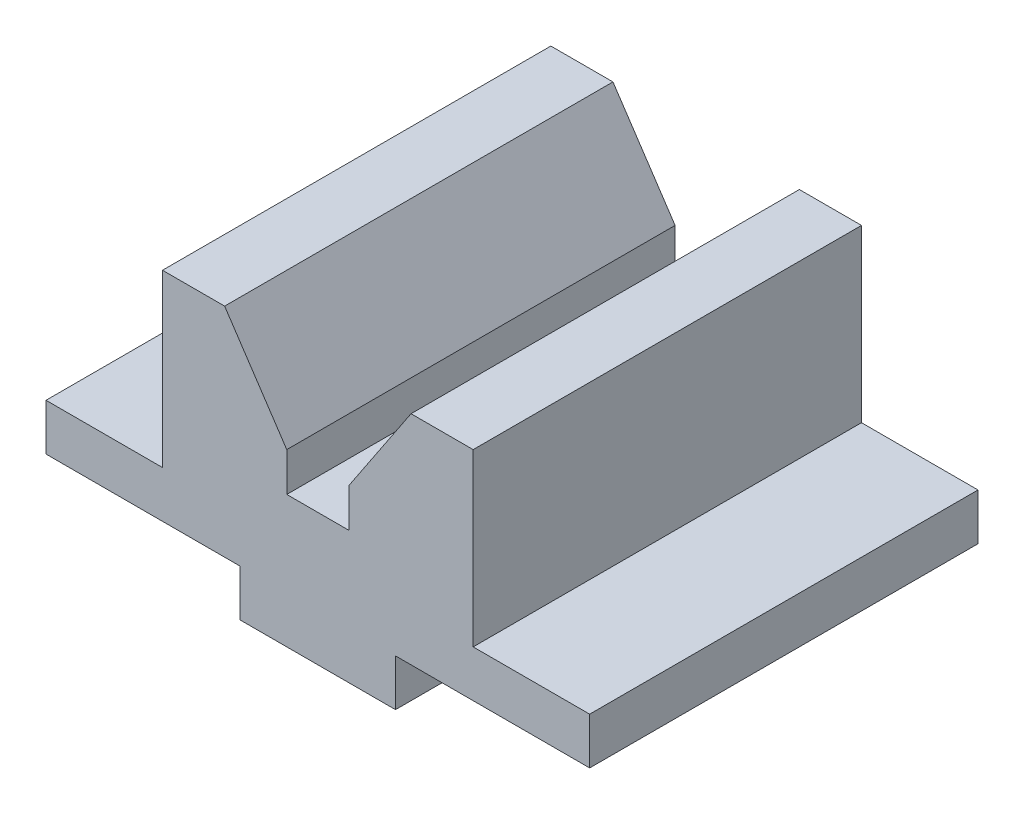
ISO-10303-21;
HEADER;
FILE_DESCRIPTION(('STEP AP214'),'2;1');
FILE_NAME('part.step','',(''),(''),'','','');
FILE_SCHEMA(('AUTOMOTIVE_DESIGN { 1 0 10303 214 1 1 1 1 }'));
ENDSEC;
DATA;
#1=APPLICATION_CONTEXT('core data for automotive mechanical design processes');
#2=APPLICATION_PROTOCOL_DEFINITION('international standard','automotive_design',2000,#1);
#3=PRODUCT_CONTEXT('',#1,'mechanical');
#4=PRODUCT('Part','Part','',(#3));
#5=PRODUCT_RELATED_PRODUCT_CATEGORY('part','',(#4));
#6=PRODUCT_DEFINITION_FORMATION('','',#4);
#7=PRODUCT_DEFINITION_CONTEXT('part definition',#1,'design');
#8=PRODUCT_DEFINITION('design','',#6,#7);
#9=PRODUCT_DEFINITION_SHAPE('','',#8);
#10=(LENGTH_UNIT() NAMED_UNIT(*) SI_UNIT(.MILLI.,.METRE.));
#11=(NAMED_UNIT(*) PLANE_ANGLE_UNIT() SI_UNIT($,.RADIAN.));
#12=(NAMED_UNIT(*) SI_UNIT($,.STERADIAN.) SOLID_ANGLE_UNIT());
#13=UNCERTAINTY_MEASURE_WITH_UNIT(LENGTH_MEASURE(1.E-05),#10,'distance_accuracy_value','');
#14=(GEOMETRIC_REPRESENTATION_CONTEXT(3) GLOBAL_UNCERTAINTY_ASSIGNED_CONTEXT((#13)) GLOBAL_UNIT_ASSIGNED_CONTEXT((#10,
#11,#12)) REPRESENTATION_CONTEXT('',''));
#15=CARTESIAN_POINT('',(0.,0.,0.));
#16=DIRECTION('',(0.,0.,1.));
#17=DIRECTION('',(1.,0.,0.));
#18=AXIS2_PLACEMENT_3D('',#15,#16,#17);
#19=CARTESIAN_POINT('',(-10.0000000000022,-6.,50.));
#20=DIRECTION('',(1.,0.,0.));
#21=DIRECTION('',(0.,0.,-1.));
#22=AXIS2_PLACEMENT_3D('',#19,#20,#21);
#23=PLANE('',#22);
#24=DIRECTION('',(0.,-1.,0.));
#25=VECTOR('',#24,1.);
#26=CARTESIAN_POINT('',(-10.0000000000022,-6.,0.));
#27=LINE('',#26,#25);
#28=CARTESIAN_POINT('',(-10.0000000000022,0.,0.));
#29=VERTEX_POINT('',#28);
#30=CARTESIAN_POINT('',(-10.0000000000022,-6.,0.));
#31=VERTEX_POINT('',#30);
#32=EDGE_CURVE('E193',#29,#31,#27,.T.);
#33=ORIENTED_EDGE('',*,*,#32,.T.);
#34=DIRECTION('',(0.,0.,-1.));
#35=VECTOR('',#34,1.);
#36=CARTESIAN_POINT('',(-10.0000000000022,-6.,50.));
#37=LINE('',#36,#35);
#38=CARTESIAN_POINT('',(-10.0000000000022,-6.,50.));
#39=VERTEX_POINT('',#38);
#40=EDGE_CURVE('E11',#39,#31,#37,.T.);
#41=ORIENTED_EDGE('',*,*,#40,.F.);
#42=DIRECTION('',(0.,-1.,0.));
#43=VECTOR('',#42,1.);
#44=CARTESIAN_POINT('',(-10.0000000000022,-6.,50.));
#45=LINE('',#44,#43);
#46=CARTESIAN_POINT('',(-10.0000000000022,0.,50.));
#47=VERTEX_POINT('',#46);
#48=EDGE_CURVE('E227',#47,#39,#45,.T.);
#49=ORIENTED_EDGE('',*,*,#48,.F.);
#50=DIRECTION('',(0.,0.,-1.));
#51=VECTOR('',#50,1.);
#52=CARTESIAN_POINT('',(-10.0000000000022,0.,50.));
#53=LINE('',#52,#51);
#54=EDGE_CURVE('E189',#47,#29,#53,.T.);
#55=ORIENTED_EDGE('',*,*,#54,.T.);
#56=EDGE_LOOP('',(#33,#41,#49,#55));
#57=FACE_BOUND('',#56,.T.);
#58=ADVANCED_FACE('F37',(#57),#23,.F.);
#59=CARTESIAN_POINT('',(10.0000000000022,-6.,50.));
#60=DIRECTION('',(0.,1.,0.));
#61=DIRECTION('',(0.,0.,1.));
#62=AXIS2_PLACEMENT_3D('',#59,#60,#61);
#63=PLANE('',#62);
#64=DIRECTION('',(1.,0.,0.));
#65=VECTOR('',#64,1.);
#66=CARTESIAN_POINT('',(10.0000000000022,-6.,0.));
#67=LINE('',#66,#65);
#68=CARTESIAN_POINT('',(10.0000000000022,-6.,0.));
#69=VERTEX_POINT('',#68);
#70=EDGE_CURVE('E196',#31,#69,#67,.T.);
#71=ORIENTED_EDGE('',*,*,#70,.T.);
#72=DIRECTION('',(0.,0.,-1.));
#73=VECTOR('',#72,1.);
#74=CARTESIAN_POINT('',(10.0000000000022,-6.,50.));
#75=LINE('',#74,#73);
#76=CARTESIAN_POINT('',(10.0000000000022,-6.,50.));
#77=VERTEX_POINT('',#76);
#78=EDGE_CURVE('E45',#77,#69,#75,.T.);
#79=ORIENTED_EDGE('',*,*,#78,.F.);
#80=DIRECTION('',(1.,0.,0.));
#81=VECTOR('',#80,1.);
#82=CARTESIAN_POINT('',(10.0000000000022,-6.,50.));
#83=LINE('',#82,#81);
#84=EDGE_CURVE('E126',#39,#77,#83,.T.);
#85=ORIENTED_EDGE('',*,*,#84,.F.);
#86=ORIENTED_EDGE('',*,*,#40,.T.);
#87=EDGE_LOOP('',(#71,#79,#85,#86));
#88=FACE_BOUND('',#87,.T.);
#89=ADVANCED_FACE('F335',(#88),#63,.F.);
#90=CARTESIAN_POINT('',(10.0000000000022,-6.,50.));
#91=DIRECTION('',(-1.,0.,0.));
#92=DIRECTION('',(0.,0.,1.));
#93=AXIS2_PLACEMENT_3D('',#90,#91,#92);
#94=PLANE('',#93);
#95=DIRECTION('',(0.,1.,0.));
#96=VECTOR('',#95,1.);
#97=CARTESIAN_POINT('',(10.0000000000022,-6.,0.));
#98=LINE('',#97,#96);
#99=CARTESIAN_POINT('',(10.0000000000022,0.,0.));
#100=VERTEX_POINT('',#99);
#101=EDGE_CURVE('E198',#69,#100,#98,.T.);
#102=ORIENTED_EDGE('',*,*,#101,.T.);
#103=DIRECTION('',(0.,0.,-1.));
#104=VECTOR('',#103,1.);
#105=CARTESIAN_POINT('',(10.0000000000022,0.,50.));
#106=LINE('',#105,#104);
#107=CARTESIAN_POINT('',(10.0000000000022,0.,50.));
#108=VERTEX_POINT('',#107);
#109=EDGE_CURVE('E264',#108,#100,#106,.T.);
#110=ORIENTED_EDGE('',*,*,#109,.F.);
#111=DIRECTION('',(0.,1.,0.));
#112=VECTOR('',#111,1.);
#113=CARTESIAN_POINT('',(10.0000000000022,-6.,50.));
#114=LINE('',#113,#112);
#115=EDGE_CURVE('E272',#77,#108,#114,.T.);
#116=ORIENTED_EDGE('',*,*,#115,.F.);
#117=ORIENTED_EDGE('',*,*,#78,.T.);
#118=EDGE_LOOP('',(#102,#110,#116,#117));
#119=FACE_BOUND('',#118,.T.);
#120=ADVANCED_FACE('F270',(#119),#94,.F.);
#121=CARTESIAN_POINT('',(10.0000000000022,0.,50.));
#122=DIRECTION('',(0.,1.,0.));
#123=DIRECTION('',(-1.,0.,0.));
#124=AXIS2_PLACEMENT_3D('',#121,#122,#123);
#125=PLANE('',#124);
#126=DIRECTION('',(1.,0.,0.));
#127=VECTOR('',#126,1.);
#128=CARTESIAN_POINT('',(10.0000000000022,0.,0.));
#129=LINE('',#128,#127);
#130=CARTESIAN_POINT('',(35.,0.,0.));
#131=VERTEX_POINT('',#130);
#132=EDGE_CURVE('E200',#100,#131,#129,.T.);
#133=ORIENTED_EDGE('',*,*,#132,.T.);
#134=DIRECTION('',(0.,0.,-1.));
#135=VECTOR('',#134,1.);
#136=CARTESIAN_POINT('',(35.,0.,50.));
#137=LINE('',#136,#135);
#138=CARTESIAN_POINT('',(35.,0.,50.));
#139=VERTEX_POINT('',#138);
#140=EDGE_CURVE('E261',#139,#131,#137,.T.);
#141=ORIENTED_EDGE('',*,*,#140,.F.);
#142=DIRECTION('',(1.,0.,0.));
#143=VECTOR('',#142,1.);
#144=CARTESIAN_POINT('',(10.0000000000022,0.,50.));
#145=LINE('',#144,#143);
#146=EDGE_CURVE('E290',#108,#139,#145,.T.);
#147=ORIENTED_EDGE('',*,*,#146,.F.);
#148=ORIENTED_EDGE('',*,*,#109,.T.);
#149=EDGE_LOOP('',(#133,#141,#147,#148));
#150=FACE_BOUND('',#149,.T.);
#151=ADVANCED_FACE('F281',(#150),#125,.F.);
#152=CARTESIAN_POINT('',(35.,0.,50.));
#153=DIRECTION('',(-1.,0.,0.));
#154=DIRECTION('',(0.,-1.,0.));
#155=AXIS2_PLACEMENT_3D('',#152,#153,#154);
#156=PLANE('',#155);
#157=DIRECTION('',(0.,1.,0.));
#158=VECTOR('',#157,1.);
#159=CARTESIAN_POINT('',(35.,0.,0.));
#160=LINE('',#159,#158);
#161=CARTESIAN_POINT('',(35.,6.,0.));
#162=VERTEX_POINT('',#161);
#163=EDGE_CURVE('E202',#131,#162,#160,.T.);
#164=ORIENTED_EDGE('',*,*,#163,.T.);
#165=DIRECTION('',(0.,0.,-1.));
#166=VECTOR('',#165,1.);
#167=CARTESIAN_POINT('',(35.,6.,50.));
#168=LINE('',#167,#166);
#169=CARTESIAN_POINT('',(35.,6.,50.));
#170=VERTEX_POINT('',#169);
#171=EDGE_CURVE('E258',#170,#162,#168,.T.);
#172=ORIENTED_EDGE('',*,*,#171,.F.);
#173=DIRECTION('',(0.,1.,0.));
#174=VECTOR('',#173,1.);
#175=CARTESIAN_POINT('',(35.,0.,50.));
#176=LINE('',#175,#174);
#177=EDGE_CURVE('E287',#139,#170,#176,.T.);
#178=ORIENTED_EDGE('',*,*,#177,.F.);
#179=ORIENTED_EDGE('',*,*,#140,.T.);
#180=EDGE_LOOP('',(#164,#172,#178,#179));
#181=FACE_BOUND('',#180,.T.);
#182=ADVANCED_FACE('F285',(#181),#156,.F.);
#183=CARTESIAN_POINT('',(35.,6.,50.));
#184=DIRECTION('',(0.,-1.,0.));
#185=DIRECTION('',(0.,0.,-1.));
#186=AXIS2_PLACEMENT_3D('',#183,#184,#185);
#187=PLANE('',#186);
#188=DIRECTION('',(-1.,0.,0.));
#189=VECTOR('',#188,1.);
#190=CARTESIAN_POINT('',(35.,6.,0.));
#191=LINE('',#190,#189);
#192=CARTESIAN_POINT('',(20.,6.,0.));
#193=VERTEX_POINT('',#192);
#194=EDGE_CURVE('E204',#162,#193,#191,.T.);
#195=ORIENTED_EDGE('',*,*,#194,.T.);
#196=DIRECTION('',(0.,0.,-1.));
#197=VECTOR('',#196,1.);
#198=CARTESIAN_POINT('',(20.,6.,50.));
#199=LINE('',#198,#197);
#200=CARTESIAN_POINT('',(20.,6.,50.));
#201=VERTEX_POINT('',#200);
#202=EDGE_CURVE('E255',#201,#193,#199,.T.);
#203=ORIENTED_EDGE('',*,*,#202,.F.);
#204=DIRECTION('',(-1.,0.,0.));
#205=VECTOR('',#204,1.);
#206=CARTESIAN_POINT('',(35.,6.,50.));
#207=LINE('',#206,#205);
#208=EDGE_CURVE('E289',#170,#201,#207,.T.);
#209=ORIENTED_EDGE('',*,*,#208,.F.);
#210=ORIENTED_EDGE('',*,*,#171,.T.);
#211=EDGE_LOOP('',(#195,#203,#209,#210));
#212=FACE_BOUND('',#211,.T.);
#213=ADVANCED_FACE('F348',(#212),#187,.F.);
#214=CARTESIAN_POINT('',(20.,6.,50.));
#215=DIRECTION('',(-1.,0.,0.));
#216=DIRECTION('',(0.,0.,1.));
#217=AXIS2_PLACEMENT_3D('',#214,#215,#216);
#218=PLANE('',#217);
#219=DIRECTION('',(0.,1.,0.));
#220=VECTOR('',#219,1.);
#221=CARTESIAN_POINT('',(20.,6.,0.));
#222=LINE('',#221,#220);
#223=CARTESIAN_POINT('',(20.,28.,0.));
#224=VERTEX_POINT('',#223);
#225=EDGE_CURVE('E206',#193,#224,#222,.T.);
#226=ORIENTED_EDGE('',*,*,#225,.T.);
#227=DIRECTION('',(0.,0.,-1.));
#228=VECTOR('',#227,1.);
#229=CARTESIAN_POINT('',(20.,28.,50.));
#230=LINE('',#229,#228);
#231=CARTESIAN_POINT('',(20.,28.,50.));
#232=VERTEX_POINT('',#231);
#233=EDGE_CURVE('E252',#232,#224,#230,.T.);
#234=ORIENTED_EDGE('',*,*,#233,.F.);
#235=DIRECTION('',(0.,1.,0.));
#236=VECTOR('',#235,1.);
#237=CARTESIAN_POINT('',(20.,6.,50.));
#238=LINE('',#237,#236);
#239=EDGE_CURVE('E292',#201,#232,#238,.T.);
#240=ORIENTED_EDGE('',*,*,#239,.F.);
#241=ORIENTED_EDGE('',*,*,#202,.T.);
#242=EDGE_LOOP('',(#226,#234,#240,#241));
#243=FACE_BOUND('',#242,.T.);
#244=ADVANCED_FACE('F351',(#243),#218,.F.);
#245=CARTESIAN_POINT('',(20.,28.,50.));
#246=DIRECTION('',(0.,-1.,0.));
#247=DIRECTION('',(0.,0.,-1.));
#248=AXIS2_PLACEMENT_3D('',#245,#246,#247);
#249=PLANE('',#248);
#250=DIRECTION('',(-1.,0.,0.));
#251=VECTOR('',#250,1.);
#252=CARTESIAN_POINT('',(20.,28.,0.));
#253=LINE('',#252,#251);
#254=CARTESIAN_POINT('',(12.,28.,0.));
#255=VERTEX_POINT('',#254);
#256=EDGE_CURVE('E208',#224,#255,#253,.T.);
#257=ORIENTED_EDGE('',*,*,#256,.T.);
#258=DIRECTION('',(0.,0.,-1.));
#259=VECTOR('',#258,1.);
#260=CARTESIAN_POINT('',(12.,28.,50.));
#261=LINE('',#260,#259);
#262=CARTESIAN_POINT('',(12.,28.,50.));
#263=VERTEX_POINT('',#262);
#264=EDGE_CURVE('E249',#263,#255,#261,.T.);
#265=ORIENTED_EDGE('',*,*,#264,.F.);
#266=DIRECTION('',(-1.,0.,0.));
#267=VECTOR('',#266,1.);
#268=CARTESIAN_POINT('',(20.,28.,50.));
#269=LINE('',#268,#267);
#270=EDGE_CURVE('E298',#232,#263,#269,.T.);
#271=ORIENTED_EDGE('',*,*,#270,.F.);
#272=ORIENTED_EDGE('',*,*,#233,.T.);
#273=EDGE_LOOP('',(#257,#265,#271,#272));
#274=FACE_BOUND('',#273,.T.);
#275=ADVANCED_FACE('F355',(#274),#249,.F.);
#276=CARTESIAN_POINT('',(12.,28.,50.));
#277=DIRECTION('',(0.832050294337843,-0.554700196225229,0.));
#278=DIRECTION('',(0.554700196225229,0.832050294337844,0.));
#279=AXIS2_PLACEMENT_3D('',#276,#277,#278);
#280=PLANE('',#279);
#281=DIRECTION('',(-0.554700196225229,-0.832050294337844,0.));
#282=VECTOR('',#281,1.);
#283=CARTESIAN_POINT('',(12.,28.,0.));
#284=LINE('',#283,#282);
#285=CARTESIAN_POINT('',(4.,16.,0.));
#286=VERTEX_POINT('',#285);
#287=EDGE_CURVE('E210',#255,#286,#284,.T.);
#288=ORIENTED_EDGE('',*,*,#287,.T.);
#289=DIRECTION('',(0.,0.,-1.));
#290=VECTOR('',#289,1.);
#291=CARTESIAN_POINT('',(4.,16.,50.));
#292=LINE('',#291,#290);
#293=CARTESIAN_POINT('',(4.,16.,50.));
#294=VERTEX_POINT('',#293);
#295=EDGE_CURVE('E246',#294,#286,#292,.T.);
#296=ORIENTED_EDGE('',*,*,#295,.F.);
#297=DIRECTION('',(-0.554700196225229,-0.832050294337844,0.));
#298=VECTOR('',#297,1.);
#299=CARTESIAN_POINT('',(12.,28.,50.));
#300=LINE('',#299,#298);
#301=EDGE_CURVE('E300',#263,#294,#300,.T.);
#302=ORIENTED_EDGE('',*,*,#301,.F.);
#303=ORIENTED_EDGE('',*,*,#264,.T.);
#304=EDGE_LOOP('',(#288,#296,#302,#303));
#305=FACE_BOUND('',#304,.T.);
#306=ADVANCED_FACE('F359',(#305),#280,.F.);
#307=CARTESIAN_POINT('',(4.,16.,50.));
#308=DIRECTION('',(1.,0.,0.));
#309=DIRECTION('',(0.,1.,0.));
#310=AXIS2_PLACEMENT_3D('',#307,#308,#309);
#311=PLANE('',#310);
#312=DIRECTION('',(0.,-1.,0.));
#313=VECTOR('',#312,1.);
#314=CARTESIAN_POINT('',(4.,16.,0.));
#315=LINE('',#314,#313);
#316=CARTESIAN_POINT('',(4.,11.,0.));
#317=VERTEX_POINT('',#316);
#318=EDGE_CURVE('E212',#286,#317,#315,.T.);
#319=ORIENTED_EDGE('',*,*,#318,.T.);
#320=DIRECTION('',(0.,0.,-1.));
#321=VECTOR('',#320,1.);
#322=CARTESIAN_POINT('',(4.,11.,50.));
#323=LINE('',#322,#321);
#324=CARTESIAN_POINT('',(4.,11.,50.));
#325=VERTEX_POINT('',#324);
#326=EDGE_CURVE('E243',#325,#317,#323,.T.);
#327=ORIENTED_EDGE('',*,*,#326,.F.);
#328=DIRECTION('',(0.,-1.,0.));
#329=VECTOR('',#328,1.);
#330=CARTESIAN_POINT('',(4.,16.,50.));
#331=LINE('',#330,#329);
#332=EDGE_CURVE('E302',#294,#325,#331,.T.);
#333=ORIENTED_EDGE('',*,*,#332,.F.);
#334=ORIENTED_EDGE('',*,*,#295,.T.);
#335=EDGE_LOOP('',(#319,#327,#333,#334));
#336=FACE_BOUND('',#335,.T.);
#337=ADVANCED_FACE('F363',(#336),#311,.F.);
#338=CARTESIAN_POINT('',(-4.,11.,50.));
#339=DIRECTION('',(0.,-1.,0.));
#340=DIRECTION('',(0.,0.,-1.));
#341=AXIS2_PLACEMENT_3D('',#338,#339,#340);
#342=PLANE('',#341);
#343=DIRECTION('',(-1.,0.,0.));
#344=VECTOR('',#343,1.);
#345=CARTESIAN_POINT('',(-4.,11.,0.));
#346=LINE('',#345,#344);
#347=CARTESIAN_POINT('',(-4.,11.,0.));
#348=VERTEX_POINT('',#347);
#349=EDGE_CURVE('E214',#317,#348,#346,.T.);
#350=ORIENTED_EDGE('',*,*,#349,.T.);
#351=DIRECTION('',(0.,0.,-1.));
#352=VECTOR('',#351,1.);
#353=CARTESIAN_POINT('',(-4.,11.,50.));
#354=LINE('',#353,#352);
#355=CARTESIAN_POINT('',(-4.,11.,50.));
#356=VERTEX_POINT('',#355);
#357=EDGE_CURVE('E240',#356,#348,#354,.T.);
#358=ORIENTED_EDGE('',*,*,#357,.F.);
#359=DIRECTION('',(-1.,0.,0.));
#360=VECTOR('',#359,1.);
#361=CARTESIAN_POINT('',(-4.,11.,50.));
#362=LINE('',#361,#360);
#363=EDGE_CURVE('E304',#325,#356,#362,.T.);
#364=ORIENTED_EDGE('',*,*,#363,.F.);
#365=ORIENTED_EDGE('',*,*,#326,.T.);
#366=EDGE_LOOP('',(#350,#358,#364,#365));
#367=FACE_BOUND('',#366,.T.);
#368=ADVANCED_FACE('F367',(#367),#342,.F.);
#369=CARTESIAN_POINT('',(-4.,16.,50.));
#370=DIRECTION('',(-1.,0.,0.));
#371=DIRECTION('',(0.,-1.,0.));
#372=AXIS2_PLACEMENT_3D('',#369,#370,#371);
#373=PLANE('',#372);
#374=DIRECTION('',(0.,1.,0.));
#375=VECTOR('',#374,1.);
#376=CARTESIAN_POINT('',(-4.,16.,0.));
#377=LINE('',#376,#375);
#378=CARTESIAN_POINT('',(-4.,16.,0.));
#379=VERTEX_POINT('',#378);
#380=EDGE_CURVE('E216',#348,#379,#377,.T.);
#381=ORIENTED_EDGE('',*,*,#380,.T.);
#382=DIRECTION('',(0.,0.,-1.));
#383=VECTOR('',#382,1.);
#384=CARTESIAN_POINT('',(-4.,16.,50.));
#385=LINE('',#384,#383);
#386=CARTESIAN_POINT('',(-4.,16.,50.));
#387=VERTEX_POINT('',#386);
#388=EDGE_CURVE('E237',#387,#379,#385,.T.);
#389=ORIENTED_EDGE('',*,*,#388,.F.);
#390=DIRECTION('',(0.,1.,0.));
#391=VECTOR('',#390,1.);
#392=CARTESIAN_POINT('',(-4.,16.,50.));
#393=LINE('',#392,#391);
#394=EDGE_CURVE('E306',#356,#387,#393,.T.);
#395=ORIENTED_EDGE('',*,*,#394,.F.);
#396=ORIENTED_EDGE('',*,*,#357,.T.);
#397=EDGE_LOOP('',(#381,#389,#395,#396));
#398=FACE_BOUND('',#397,.T.);
#399=ADVANCED_FACE('F371',(#398),#373,.F.);
#400=CARTESIAN_POINT('',(-12.,28.,50.));
#401=DIRECTION('',(-0.832050294337843,-0.554700196225229,0.));
#402=DIRECTION('',(0.554700196225229,-0.832050294337844,0.));
#403=AXIS2_PLACEMENT_3D('',#400,#401,#402);
#404=PLANE('',#403);
#405=DIRECTION('',(-0.554700196225229,0.832050294337844,0.));
#406=VECTOR('',#405,1.);
#407=CARTESIAN_POINT('',(-12.,28.,0.));
#408=LINE('',#407,#406);
#409=CARTESIAN_POINT('',(-12.,28.,0.));
#410=VERTEX_POINT('',#409);
#411=EDGE_CURVE('E218',#379,#410,#408,.T.);
#412=ORIENTED_EDGE('',*,*,#411,.T.);
#413=DIRECTION('',(0.,0.,-1.));
#414=VECTOR('',#413,1.);
#415=CARTESIAN_POINT('',(-12.,28.,50.));
#416=LINE('',#415,#414);
#417=CARTESIAN_POINT('',(-12.,28.,50.));
#418=VERTEX_POINT('',#417);
#419=EDGE_CURVE('E234',#418,#410,#416,.T.);
#420=ORIENTED_EDGE('',*,*,#419,.F.);
#421=DIRECTION('',(-0.554700196225229,0.832050294337844,0.));
#422=VECTOR('',#421,1.);
#423=CARTESIAN_POINT('',(-12.,28.,50.));
#424=LINE('',#423,#422);
#425=EDGE_CURVE('E308',#387,#418,#424,.T.);
#426=ORIENTED_EDGE('',*,*,#425,.F.);
#427=ORIENTED_EDGE('',*,*,#388,.T.);
#428=EDGE_LOOP('',(#412,#420,#426,#427));
#429=FACE_BOUND('',#428,.T.);
#430=ADVANCED_FACE('F375',(#429),#404,.F.);
#431=CARTESIAN_POINT('',(-20.,28.,50.));
#432=DIRECTION('',(0.,-1.,0.));
#433=DIRECTION('',(0.,0.,-1.));
#434=AXIS2_PLACEMENT_3D('',#431,#432,#433);
#435=PLANE('',#434);
#436=DIRECTION('',(-1.,0.,0.));
#437=VECTOR('',#436,1.);
#438=CARTESIAN_POINT('',(-20.,28.,0.));
#439=LINE('',#438,#437);
#440=CARTESIAN_POINT('',(-20.,28.,0.));
#441=VERTEX_POINT('',#440);
#442=EDGE_CURVE('E220',#410,#441,#439,.T.);
#443=ORIENTED_EDGE('',*,*,#442,.T.);
#444=DIRECTION('',(0.,0.,-1.));
#445=VECTOR('',#444,1.);
#446=CARTESIAN_POINT('',(-20.,28.,50.));
#447=LINE('',#446,#445);
#448=CARTESIAN_POINT('',(-20.,28.,50.));
#449=VERTEX_POINT('',#448);
#450=EDGE_CURVE('E231',#449,#441,#447,.T.);
#451=ORIENTED_EDGE('',*,*,#450,.F.);
#452=DIRECTION('',(-1.,0.,0.));
#453=VECTOR('',#452,1.);
#454=CARTESIAN_POINT('',(-20.,28.,50.));
#455=LINE('',#454,#453);
#456=EDGE_CURVE('E310',#418,#449,#455,.T.);
#457=ORIENTED_EDGE('',*,*,#456,.F.);
#458=ORIENTED_EDGE('',*,*,#419,.T.);
#459=EDGE_LOOP('',(#443,#451,#457,#458));
#460=FACE_BOUND('',#459,.T.);
#461=ADVANCED_FACE('F316',(#460),#435,.F.);
#462=CARTESIAN_POINT('',(-20.,6.,50.));
#463=DIRECTION('',(1.,0.,0.));
#464=DIRECTION('',(0.,0.,-1.));
#465=AXIS2_PLACEMENT_3D('',#462,#463,#464);
#466=PLANE('',#465);
#467=DIRECTION('',(0.,-1.,0.));
#468=VECTOR('',#467,1.);
#469=CARTESIAN_POINT('',(-20.,6.,0.));
#470=LINE('',#469,#468);
#471=CARTESIAN_POINT('',(-20.,6.,0.));
#472=VERTEX_POINT('',#471);
#473=EDGE_CURVE('E222',#441,#472,#470,.T.);
#474=ORIENTED_EDGE('',*,*,#473,.T.);
#475=DIRECTION('',(0.,0.,-1.));
#476=VECTOR('',#475,1.);
#477=CARTESIAN_POINT('',(-20.,6.,50.));
#478=LINE('',#477,#476);
#479=CARTESIAN_POINT('',(-20.,6.,50.));
#480=VERTEX_POINT('',#479);
#481=EDGE_CURVE('E184',#480,#472,#478,.T.);
#482=ORIENTED_EDGE('',*,*,#481,.F.);
#483=DIRECTION('',(0.,-1.,0.));
#484=VECTOR('',#483,1.);
#485=CARTESIAN_POINT('',(-20.,6.,50.));
#486=LINE('',#485,#484);
#487=EDGE_CURVE('E175',#449,#480,#486,.T.);
#488=ORIENTED_EDGE('',*,*,#487,.F.);
#489=ORIENTED_EDGE('',*,*,#450,.T.);
#490=EDGE_LOOP('',(#474,#482,#488,#489));
#491=FACE_BOUND('',#490,.T.);
#492=ADVANCED_FACE('F320',(#491),#466,.F.);
#493=CARTESIAN_POINT('',(-35.,6.,50.));
#494=DIRECTION('',(0.,-1.,0.));
#495=DIRECTION('',(0.,0.,-1.));
#496=AXIS2_PLACEMENT_3D('',#493,#494,#495);
#497=PLANE('',#496);
#498=DIRECTION('',(-1.,0.,0.));
#499=VECTOR('',#498,1.);
#500=CARTESIAN_POINT('',(-35.,6.,0.));
#501=LINE('',#500,#499);
#502=CARTESIAN_POINT('',(-35.,6.,0.));
#503=VERTEX_POINT('',#502);
#504=EDGE_CURVE('E183',#472,#503,#501,.T.);
#505=ORIENTED_EDGE('',*,*,#504,.T.);
#506=DIRECTION('',(0.,0.,-1.));
#507=VECTOR('',#506,1.);
#508=CARTESIAN_POINT('',(-35.,6.,50.));
#509=LINE('',#508,#507);
#510=CARTESIAN_POINT('',(-35.,6.,50.));
#511=VERTEX_POINT('',#510);
#512=EDGE_CURVE('E180',#511,#503,#509,.T.);
#513=ORIENTED_EDGE('',*,*,#512,.F.);
#514=DIRECTION('',(-1.,0.,0.));
#515=VECTOR('',#514,1.);
#516=CARTESIAN_POINT('',(-35.,6.,50.));
#517=LINE('',#516,#515);
#518=EDGE_CURVE('E169',#480,#511,#517,.T.);
#519=ORIENTED_EDGE('',*,*,#518,.F.);
#520=ORIENTED_EDGE('',*,*,#481,.T.);
#521=EDGE_LOOP('',(#505,#513,#519,#520));
#522=FACE_BOUND('',#521,.T.);
#523=ADVANCED_FACE('F181',(#522),#497,.F.);
#524=CARTESIAN_POINT('',(-35.,0.,50.));
#525=DIRECTION('',(1.,0.,0.));
#526=DIRECTION('',(0.,1.,0.));
#527=AXIS2_PLACEMENT_3D('',#524,#525,#526);
#528=PLANE('',#527);
#529=DIRECTION('',(0.,-1.,0.));
#530=VECTOR('',#529,1.);
#531=CARTESIAN_POINT('',(-35.,0.,0.));
#532=LINE('',#531,#530);
#533=CARTESIAN_POINT('',(-35.,0.,0.));
#534=VERTEX_POINT('',#533);
#535=EDGE_CURVE('E112',#503,#534,#532,.T.);
#536=ORIENTED_EDGE('',*,*,#535,.T.);
#537=DIRECTION('',(0.,0.,-1.));
#538=VECTOR('',#537,1.);
#539=CARTESIAN_POINT('',(-35.,0.,50.));
#540=LINE('',#539,#538);
#541=CARTESIAN_POINT('',(-35.,0.,50.));
#542=VERTEX_POINT('',#541);
#543=EDGE_CURVE('E185',#542,#534,#540,.T.);
#544=ORIENTED_EDGE('',*,*,#543,.F.);
#545=DIRECTION('',(0.,-1.,0.));
#546=VECTOR('',#545,1.);
#547=CARTESIAN_POINT('',(-35.,0.,50.));
#548=LINE('',#547,#546);
#549=EDGE_CURVE('E173',#511,#542,#548,.T.);
#550=ORIENTED_EDGE('',*,*,#549,.F.);
#551=ORIENTED_EDGE('',*,*,#512,.T.);
#552=EDGE_LOOP('',(#536,#544,#550,#551));
#553=FACE_BOUND('',#552,.T.);
#554=ADVANCED_FACE('F187',(#553),#528,.F.);
#555=CARTESIAN_POINT('',(-10.0000000000022,0.,50.));
#556=DIRECTION('',(0.,1.,0.));
#557=DIRECTION('',(-1.,0.,0.));
#558=AXIS2_PLACEMENT_3D('',#555,#556,#557);
#559=PLANE('',#558);
#560=DIRECTION('',(1.,0.,0.));
#561=VECTOR('',#560,1.);
#562=CARTESIAN_POINT('',(-10.0000000000022,0.,0.));
#563=LINE('',#562,#561);
#564=EDGE_CURVE('E118',#534,#29,#563,.T.);
#565=ORIENTED_EDGE('',*,*,#564,.T.);
#566=ORIENTED_EDGE('',*,*,#54,.F.);
#567=DIRECTION('',(1.,0.,0.));
#568=VECTOR('',#567,1.);
#569=CARTESIAN_POINT('',(-10.0000000000022,0.,50.));
#570=LINE('',#569,#568);
#571=EDGE_CURVE('E53',#542,#47,#570,.T.);
#572=ORIENTED_EDGE('',*,*,#571,.F.);
#573=ORIENTED_EDGE('',*,*,#543,.T.);
#574=EDGE_LOOP('',(#565,#566,#572,#573));
#575=FACE_BOUND('',#574,.T.);
#576=ADVANCED_FACE('F324',(#575),#559,.F.);
#577=CARTESIAN_POINT('',(0.,0.,50.));
#578=DIRECTION('',(0.,0.,1.));
#579=DIRECTION('',(1.,0.,0.));
#580=AXIS2_PLACEMENT_3D('',#577,#578,#579);
#581=PLANE('',#580);
#582=ORIENTED_EDGE('',*,*,#48,.T.);
#583=ORIENTED_EDGE('',*,*,#84,.T.);
#584=ORIENTED_EDGE('',*,*,#115,.T.);
#585=ORIENTED_EDGE('',*,*,#146,.T.);
#586=ORIENTED_EDGE('',*,*,#177,.T.);
#587=ORIENTED_EDGE('',*,*,#208,.T.);
#588=ORIENTED_EDGE('',*,*,#239,.T.);
#589=ORIENTED_EDGE('',*,*,#270,.T.);
#590=ORIENTED_EDGE('',*,*,#301,.T.);
#591=ORIENTED_EDGE('',*,*,#332,.T.);
#592=ORIENTED_EDGE('',*,*,#363,.T.);
#593=ORIENTED_EDGE('',*,*,#394,.T.);
#594=ORIENTED_EDGE('',*,*,#425,.T.);
#595=ORIENTED_EDGE('',*,*,#456,.T.);
#596=ORIENTED_EDGE('',*,*,#487,.T.);
#597=ORIENTED_EDGE('',*,*,#518,.T.);
#598=ORIENTED_EDGE('',*,*,#549,.T.);
#599=ORIENTED_EDGE('',*,*,#571,.T.);
#600=EDGE_LOOP('',(#582,#583,#584,#585,#586,#587,#588,#589,#590,#591,#592,#593,#594,#595,#596,
#597,#598,#599));
#601=FACE_BOUND('',#600,.T.);
#602=ADVANCED_FACE('F171',(#601),#581,.T.);
#603=CARTESIAN_POINT('',(0.,0.,0.));
#604=DIRECTION('',(0.,0.,1.));
#605=DIRECTION('',(1.,0.,0.));
#606=AXIS2_PLACEMENT_3D('',#603,#604,#605);
#607=PLANE('',#606);
#608=ORIENTED_EDGE('',*,*,#32,.F.);
#609=ORIENTED_EDGE('',*,*,#564,.F.);
#610=ORIENTED_EDGE('',*,*,#535,.F.);
#611=ORIENTED_EDGE('',*,*,#504,.F.);
#612=ORIENTED_EDGE('',*,*,#473,.F.);
#613=ORIENTED_EDGE('',*,*,#442,.F.);
#614=ORIENTED_EDGE('',*,*,#411,.F.);
#615=ORIENTED_EDGE('',*,*,#380,.F.);
#616=ORIENTED_EDGE('',*,*,#349,.F.);
#617=ORIENTED_EDGE('',*,*,#318,.F.);
#618=ORIENTED_EDGE('',*,*,#287,.F.);
#619=ORIENTED_EDGE('',*,*,#256,.F.);
#620=ORIENTED_EDGE('',*,*,#225,.F.);
#621=ORIENTED_EDGE('',*,*,#194,.F.);
#622=ORIENTED_EDGE('',*,*,#163,.F.);
#623=ORIENTED_EDGE('',*,*,#132,.F.);
#624=ORIENTED_EDGE('',*,*,#101,.F.);
#625=ORIENTED_EDGE('',*,*,#70,.F.);
#626=EDGE_LOOP('',(#608,#609,#610,#611,#612,#613,#614,#615,#616,#617,#618,#619,#620,#621,#622,
#623,#624,#625));
#627=FACE_BOUND('',#626,.T.);
#628=ADVANCED_FACE('F276',(#627),#607,.F.);
#629=CLOSED_SHELL('',(#58,#89,#120,#151,#182,#213,#244,#275,#306,#337,#368,#399,#430,#461,#492,
#523,#554,#576,#602,#628));
#630=MANIFOLD_SOLID_BREP('B2',#629);
#631=ADVANCED_BREP_SHAPE_REPRESENTATION('',(#18,#630),#14);
#632=SHAPE_DEFINITION_REPRESENTATION(#9,#631);
ENDSEC;
END-ISO-10303-21;
